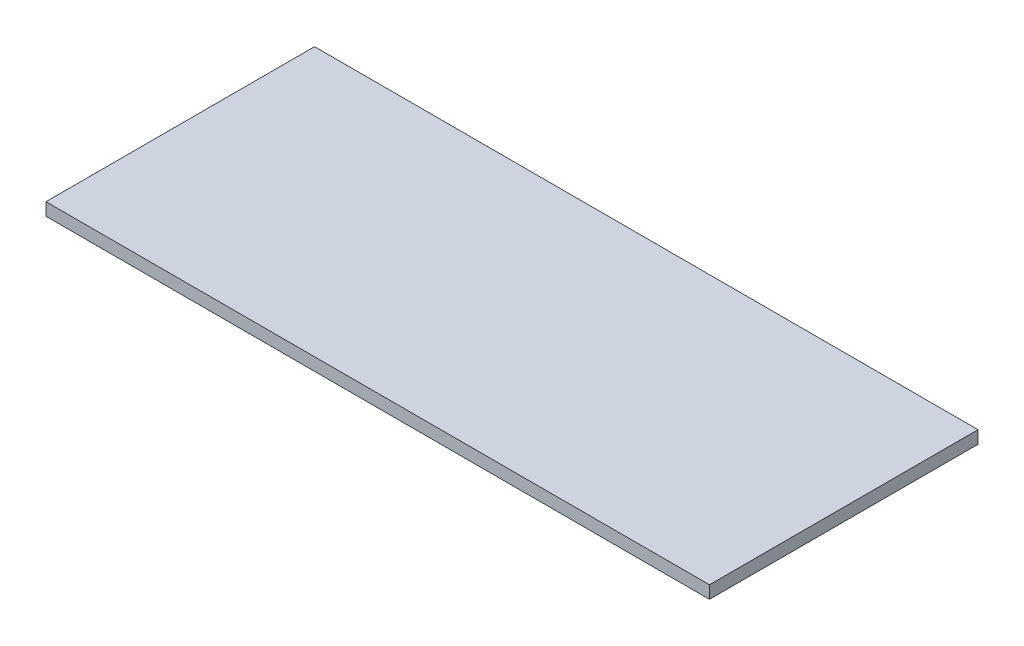
ISO-10303-21;
HEADER;
FILE_DESCRIPTION(('STEP AP214'),'2;1');
FILE_NAME('part.step','',(''),(''),'','','');
FILE_SCHEMA(('AUTOMOTIVE_DESIGN { 1 0 10303 214 1 1 1 1 }'));
ENDSEC;
DATA;
#1=APPLICATION_CONTEXT('core data for automotive mechanical design processes');
#2=APPLICATION_PROTOCOL_DEFINITION('international standard','automotive_design',2000,#1);
#3=PRODUCT_CONTEXT('',#1,'mechanical');
#4=PRODUCT('Part','Part','',(#3));
#5=PRODUCT_RELATED_PRODUCT_CATEGORY('part','',(#4));
#6=PRODUCT_DEFINITION_FORMATION('','',#4);
#7=PRODUCT_DEFINITION_CONTEXT('part definition',#1,'design');
#8=PRODUCT_DEFINITION('design','',#6,#7);
#9=PRODUCT_DEFINITION_SHAPE('','',#8);
#10=(LENGTH_UNIT() NAMED_UNIT(*) SI_UNIT(.MILLI.,.METRE.));
#11=(NAMED_UNIT(*) PLANE_ANGLE_UNIT() SI_UNIT($,.RADIAN.));
#12=(NAMED_UNIT(*) SI_UNIT($,.STERADIAN.) SOLID_ANGLE_UNIT());
#13=UNCERTAINTY_MEASURE_WITH_UNIT(LENGTH_MEASURE(1.E-05),#10,'distance_accuracy_value','');
#14=(GEOMETRIC_REPRESENTATION_CONTEXT(3) GLOBAL_UNCERTAINTY_ASSIGNED_CONTEXT((#13)) GLOBAL_UNIT_ASSIGNED_CONTEXT((#10,
#11,#12)) REPRESENTATION_CONTEXT('',''));
#15=CARTESIAN_POINT('',(0.,0.,0.));
#16=DIRECTION('',(0.,0.,1.));
#17=DIRECTION('',(1.,0.,0.));
#18=AXIS2_PLACEMENT_3D('',#15,#16,#17);
#19=CARTESIAN_POINT('',(-1050.,40.,-425.));
#20=DIRECTION('',(1.,0.,0.));
#21=DIRECTION('',(0.,0.,-1.));
#22=AXIS2_PLACEMENT_3D('',#19,#20,#21);
#23=PLANE('',#22);
#24=DIRECTION('',(0.,0.,1.));
#25=VECTOR('',#24,1.);
#26=CARTESIAN_POINT('',(-1050.,0.,-425.));
#27=LINE('',#26,#25);
#28=CARTESIAN_POINT('',(-1050.,0.,-425.));
#29=VERTEX_POINT('',#28);
#30=CARTESIAN_POINT('',(-1050.,0.,425.));
#31=VERTEX_POINT('',#30);
#32=EDGE_CURVE('E96',#29,#31,#27,.T.);
#33=ORIENTED_EDGE('',*,*,#32,.T.);
#34=DIRECTION('',(0.,-1.,0.));
#35=VECTOR('',#34,1.);
#36=CARTESIAN_POINT('',(-1050.,40.,425.));
#37=LINE('',#36,#35);
#38=CARTESIAN_POINT('',(-1050.,40.,425.));
#39=VERTEX_POINT('',#38);
#40=EDGE_CURVE('E11',#39,#31,#37,.T.);
#41=ORIENTED_EDGE('',*,*,#40,.F.);
#42=DIRECTION('',(0.,0.,1.));
#43=VECTOR('',#42,1.);
#44=CARTESIAN_POINT('',(-1050.,40.,-425.));
#45=LINE('',#44,#43);
#46=CARTESIAN_POINT('',(-1050.,40.,-425.));
#47=VERTEX_POINT('',#46);
#48=EDGE_CURVE('E84',#47,#39,#45,.T.);
#49=ORIENTED_EDGE('',*,*,#48,.F.);
#50=DIRECTION('',(0.,-1.,0.));
#51=VECTOR('',#50,1.);
#52=CARTESIAN_POINT('',(-1050.,40.,-425.));
#53=LINE('',#52,#51);
#54=EDGE_CURVE('E92',#47,#29,#53,.T.);
#55=ORIENTED_EDGE('',*,*,#54,.T.);
#56=EDGE_LOOP('',(#33,#41,#49,#55));
#57=FACE_BOUND('',#56,.T.);
#58=ADVANCED_FACE('F33',(#57),#23,.F.);
#59=CARTESIAN_POINT('',(-1050.,40.,425.));
#60=DIRECTION('',(0.,0.,-1.));
#61=DIRECTION('',(-1.,0.,0.));
#62=AXIS2_PLACEMENT_3D('',#59,#60,#61);
#63=PLANE('',#62);
#64=DIRECTION('',(1.,0.,0.));
#65=VECTOR('',#64,1.);
#66=CARTESIAN_POINT('',(-1050.,0.,425.));
#67=LINE('',#66,#65);
#68=CARTESIAN_POINT('',(1050.,0.,425.));
#69=VERTEX_POINT('',#68);
#70=EDGE_CURVE('E88',#31,#69,#67,.T.);
#71=ORIENTED_EDGE('',*,*,#70,.T.);
#72=DIRECTION('',(0.,-1.,0.));
#73=VECTOR('',#72,1.);
#74=CARTESIAN_POINT('',(1050.,40.,425.));
#75=LINE('',#74,#73);
#76=CARTESIAN_POINT('',(1050.,40.,425.));
#77=VERTEX_POINT('',#76);
#78=EDGE_CURVE('E41',#77,#69,#75,.T.);
#79=ORIENTED_EDGE('',*,*,#78,.F.);
#80=DIRECTION('',(1.,0.,0.));
#81=VECTOR('',#80,1.);
#82=CARTESIAN_POINT('',(-1050.,40.,425.));
#83=LINE('',#82,#81);
#84=EDGE_CURVE('E79',#39,#77,#83,.T.);
#85=ORIENTED_EDGE('',*,*,#84,.F.);
#86=ORIENTED_EDGE('',*,*,#40,.T.);
#87=EDGE_LOOP('',(#71,#79,#85,#86));
#88=FACE_BOUND('',#87,.T.);
#89=ADVANCED_FACE('F87',(#88),#63,.F.);
#90=CARTESIAN_POINT('',(1050.,40.,-425.));
#91=DIRECTION('',(-1.,0.,0.));
#92=DIRECTION('',(0.,0.,1.));
#93=AXIS2_PLACEMENT_3D('',#90,#91,#92);
#94=PLANE('',#93);
#95=DIRECTION('',(0.,0.,-1.));
#96=VECTOR('',#95,1.);
#97=CARTESIAN_POINT('',(1050.,0.,-425.));
#98=LINE('',#97,#96);
#99=CARTESIAN_POINT('',(1050.,0.,-425.));
#100=VERTEX_POINT('',#99);
#101=EDGE_CURVE('E66',#69,#100,#98,.T.);
#102=ORIENTED_EDGE('',*,*,#101,.T.);
#103=DIRECTION('',(0.,-1.,0.));
#104=VECTOR('',#103,1.);
#105=CARTESIAN_POINT('',(1050.,40.,-425.));
#106=LINE('',#105,#104);
#107=CARTESIAN_POINT('',(1050.,40.,-425.));
#108=VERTEX_POINT('',#107);
#109=EDGE_CURVE('E89',#108,#100,#106,.T.);
#110=ORIENTED_EDGE('',*,*,#109,.F.);
#111=DIRECTION('',(0.,0.,-1.));
#112=VECTOR('',#111,1.);
#113=CARTESIAN_POINT('',(1050.,40.,-425.));
#114=LINE('',#113,#112);
#115=EDGE_CURVE('E82',#77,#108,#114,.T.);
#116=ORIENTED_EDGE('',*,*,#115,.F.);
#117=ORIENTED_EDGE('',*,*,#78,.T.);
#118=EDGE_LOOP('',(#102,#110,#116,#117));
#119=FACE_BOUND('',#118,.T.);
#120=ADVANCED_FACE('F90',(#119),#94,.F.);
#121=CARTESIAN_POINT('',(-1050.,40.,-425.));
#122=DIRECTION('',(0.,0.,1.));
#123=DIRECTION('',(1.,0.,0.));
#124=AXIS2_PLACEMENT_3D('',#121,#122,#123);
#125=PLANE('',#124);
#126=DIRECTION('',(-1.,0.,0.));
#127=VECTOR('',#126,1.);
#128=CARTESIAN_POINT('',(-1050.,0.,-425.));
#129=LINE('',#128,#127);
#130=EDGE_CURVE('E72',#100,#29,#129,.T.);
#131=ORIENTED_EDGE('',*,*,#130,.T.);
#132=ORIENTED_EDGE('',*,*,#54,.F.);
#133=DIRECTION('',(-1.,0.,0.));
#134=VECTOR('',#133,1.);
#135=CARTESIAN_POINT('',(-1050.,40.,-425.));
#136=LINE('',#135,#134);
#137=EDGE_CURVE('E49',#108,#47,#136,.T.);
#138=ORIENTED_EDGE('',*,*,#137,.F.);
#139=ORIENTED_EDGE('',*,*,#109,.T.);
#140=EDGE_LOOP('',(#131,#132,#138,#139));
#141=FACE_BOUND('',#140,.T.);
#142=ADVANCED_FACE('F103',(#141),#125,.F.);
#143=CARTESIAN_POINT('',(0.,40.,0.));
#144=DIRECTION('',(0.,1.,0.));
#145=DIRECTION('',(0.,0.,1.));
#146=AXIS2_PLACEMENT_3D('',#143,#144,#145);
#147=PLANE('',#146);
#148=ORIENTED_EDGE('',*,*,#48,.T.);
#149=ORIENTED_EDGE('',*,*,#84,.T.);
#150=ORIENTED_EDGE('',*,*,#115,.T.);
#151=ORIENTED_EDGE('',*,*,#137,.T.);
#152=EDGE_LOOP('',(#148,#149,#150,#151));
#153=FACE_BOUND('',#152,.T.);
#154=ADVANCED_FACE('F80',(#153),#147,.T.);
#155=CARTESIAN_POINT('',(0.,0.,0.));
#156=DIRECTION('',(0.,1.,0.));
#157=DIRECTION('',(0.,0.,1.));
#158=AXIS2_PLACEMENT_3D('',#155,#156,#157);
#159=PLANE('',#158);
#160=ORIENTED_EDGE('',*,*,#32,.F.);
#161=ORIENTED_EDGE('',*,*,#130,.F.);
#162=ORIENTED_EDGE('',*,*,#101,.F.);
#163=ORIENTED_EDGE('',*,*,#70,.F.);
#164=EDGE_LOOP('',(#160,#161,#162,#163));
#165=FACE_BOUND('',#164,.T.);
#166=ADVANCED_FACE('F106',(#165),#159,.F.);
#167=CLOSED_SHELL('',(#58,#89,#120,#142,#154,#166));
#168=MANIFOLD_SOLID_BREP('B2',#167);
#169=ADVANCED_BREP_SHAPE_REPRESENTATION('',(#18,#168),#14);
#170=SHAPE_DEFINITION_REPRESENTATION(#9,#169);
ENDSEC;
END-ISO-10303-21;
